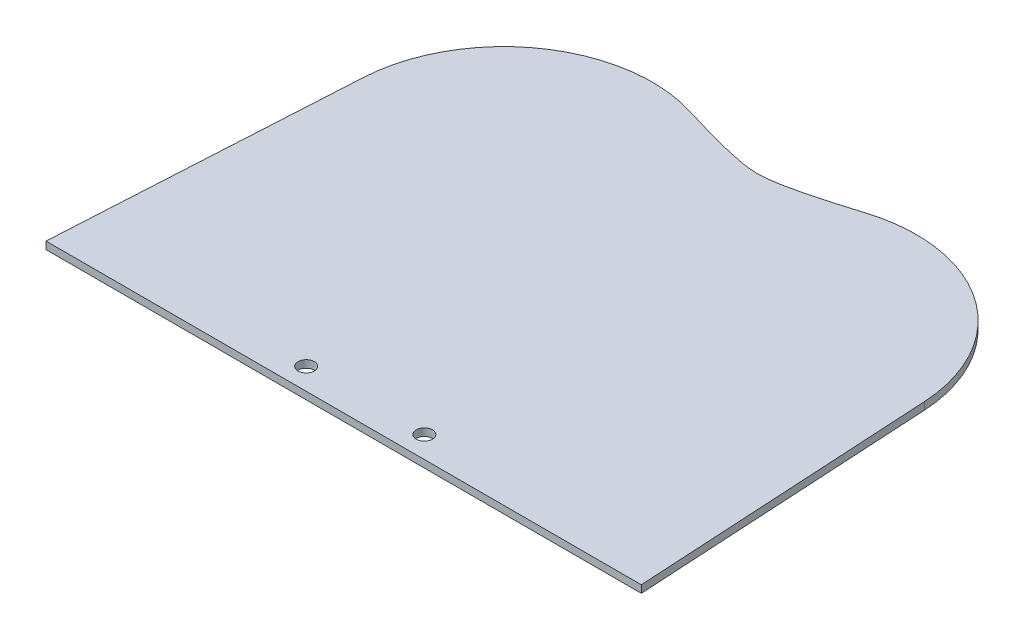
ISO-10303-21;
HEADER;
FILE_DESCRIPTION(('STEP AP214'),'2;1');
FILE_NAME('part.step','',(''),(''),'','','');
FILE_SCHEMA(('AUTOMOTIVE_DESIGN { 1 0 10303 214 1 1 1 1 }'));
ENDSEC;
DATA;
#1=APPLICATION_CONTEXT('core data for automotive mechanical design processes');
#2=APPLICATION_PROTOCOL_DEFINITION('international standard','automotive_design',2000,#1);
#3=PRODUCT_CONTEXT('',#1,'mechanical');
#4=PRODUCT('Part','Part','',(#3));
#5=PRODUCT_RELATED_PRODUCT_CATEGORY('part','',(#4));
#6=PRODUCT_DEFINITION_FORMATION('','',#4);
#7=PRODUCT_DEFINITION_CONTEXT('part definition',#1,'design');
#8=PRODUCT_DEFINITION('design','',#6,#7);
#9=PRODUCT_DEFINITION_SHAPE('','',#8);
#10=(LENGTH_UNIT() NAMED_UNIT(*) SI_UNIT(.MILLI.,.METRE.));
#11=(NAMED_UNIT(*) PLANE_ANGLE_UNIT() SI_UNIT($,.RADIAN.));
#12=(NAMED_UNIT(*) SI_UNIT($,.STERADIAN.) SOLID_ANGLE_UNIT());
#13=UNCERTAINTY_MEASURE_WITH_UNIT(LENGTH_MEASURE(1.E-05),#10,'distance_accuracy_value','');
#14=(GEOMETRIC_REPRESENTATION_CONTEXT(3) GLOBAL_UNCERTAINTY_ASSIGNED_CONTEXT((#13)) GLOBAL_UNIT_ASSIGNED_CONTEXT((#10,
#11,#12)) REPRESENTATION_CONTEXT('',''));
#15=CARTESIAN_POINT('',(0.,0.,0.));
#16=DIRECTION('',(0.,0.,1.));
#17=DIRECTION('',(1.,0.,0.));
#18=AXIS2_PLACEMENT_3D('',#15,#16,#17);
#19=CARTESIAN_POINT('',(0.,2.,0.));
#20=DIRECTION('',(0.,0.,-1.));
#21=DIRECTION('',(-1.,0.,0.));
#22=AXIS2_PLACEMENT_3D('',#19,#20,#21);
#23=PLANE('',#22);
#24=DIRECTION('',(1.,0.,0.));
#25=VECTOR('',#24,1.);
#26=CARTESIAN_POINT('',(0.,0.,0.));
#27=LINE('',#26,#25);
#28=CARTESIAN_POINT('',(0.,0.,0.));
#29=VERTEX_POINT('',#28);
#30=CARTESIAN_POINT('',(160.,0.,0.));
#31=VERTEX_POINT('',#30);
#32=EDGE_CURVE('E107',#29,#31,#27,.T.);
#33=ORIENTED_EDGE('',*,*,#32,.T.);
#34=DIRECTION('',(0.,-1.,0.));
#35=VECTOR('',#34,1.);
#36=CARTESIAN_POINT('',(160.,2.,0.));
#37=LINE('',#36,#35);
#38=CARTESIAN_POINT('',(160.,2.,0.));
#39=VERTEX_POINT('',#38);
#40=EDGE_CURVE('E48',#39,#31,#37,.T.);
#41=ORIENTED_EDGE('',*,*,#40,.F.);
#42=DIRECTION('',(1.,0.,0.));
#43=VECTOR('',#42,1.);
#44=CARTESIAN_POINT('',(0.,2.,0.));
#45=LINE('',#44,#43);
#46=CARTESIAN_POINT('',(0.,2.,0.));
#47=VERTEX_POINT('',#46);
#48=EDGE_CURVE('E113',#47,#39,#45,.T.);
#49=ORIENTED_EDGE('',*,*,#48,.F.);
#50=DIRECTION('',(0.,-1.,0.));
#51=VECTOR('',#50,1.);
#52=CARTESIAN_POINT('',(0.,2.,0.));
#53=LINE('',#52,#51);
#54=EDGE_CURVE('E11',#47,#29,#53,.T.);
#55=ORIENTED_EDGE('',*,*,#54,.T.);
#56=EDGE_LOOP('',(#33,#41,#49,#55));
#57=FACE_BOUND('',#56,.T.);
#58=ADVANCED_FACE('F41',(#57),#23,.F.);
#59=CARTESIAN_POINT('',(0.,2.,0.));
#60=DIRECTION('',(0.,-1.,0.));
#61=DIRECTION('',(0.,0.,-1.));
#62=AXIS2_PLACEMENT_3D('',#59,#60,#61);
#63=PLANE('',#62);
#64=CARTESIAN_POINT('',(64.12,2.,-5.81));
#65=DIRECTION('',(0.,1.,0.));
#66=DIRECTION('',(0.,0.,1.));
#67=AXIS2_PLACEMENT_3D('',#64,#65,#66);
#68=CIRCLE('',#67,2.185);
#69=CARTESIAN_POINT('',(64.12,2.,-3.625));
#70=VERTEX_POINT('',#69);
#71=EDGE_CURVE('E128',#70,#70,#68,.T.);
#72=ORIENTED_EDGE('',*,*,#71,.F.);
#73=EDGE_LOOP('',(#72));
#74=FACE_BOUND('',#73,.T.);
#75=CARTESIAN_POINT('',(95.87,2.,-5.81));
#76=DIRECTION('',(0.,1.,0.));
#77=DIRECTION('',(0.,0.,1.));
#78=AXIS2_PLACEMENT_3D('',#75,#76,#77);
#79=CIRCLE('',#78,2.185);
#80=CARTESIAN_POINT('',(95.87,2.,-3.625));
#81=VERTEX_POINT('',#80);
#82=EDGE_CURVE('E122',#81,#81,#79,.T.);
#83=ORIENTED_EDGE('',*,*,#82,.F.);
#84=EDGE_LOOP('',(#83));
#85=FACE_BOUND('',#84,.T.);
#86=CARTESIAN_POINT('',(44.5206222699094,2.,-78.48676821735));
#87=DIRECTION('',(0.,-1.,0.));
#88=DIRECTION('',(0.,0.,-1.));
#89=AXIS2_PLACEMENT_3D('',#86,#87,#88);
#90=CIRCLE('',#89,40.);
#91=CARTESIAN_POINT('',(4.58493819976732,2.,-80.7541759552303));
#92=VERTEX_POINT('',#91);
#93=CARTESIAN_POINT('',(56.3933458143429,2.,-116.684129849241));
#94=VERTEX_POINT('',#93);
#95=EDGE_CURVE('E281',#92,#94,#90,.T.);
#96=ORIENTED_EDGE('',*,*,#95,.F.);
#97=DIRECTION('',(0.0566851934470067,0.,-0.998392101753552));
#98=VECTOR('',#97,1.);
#99=CARTESIAN_POINT('',(0.,2.,0.));
#100=LINE('',#99,#98);
#101=EDGE_CURVE('E287',#47,#92,#100,.T.);
#102=ORIENTED_EDGE('',*,*,#101,.F.);
#103=ORIENTED_EDGE('',*,*,#48,.T.);
#104=DIRECTION('',(0.0566851934470067,0.,0.998392101753552));
#105=VECTOR('',#104,1.);
#106=CARTESIAN_POINT('',(160.,2.,0.));
#107=LINE('',#106,#105);
#108=CARTESIAN_POINT('',(155.415061800233,2.,-80.7541759552303));
#109=VERTEX_POINT('',#108);
#110=EDGE_CURVE('E60',#109,#39,#107,.T.);
#111=ORIENTED_EDGE('',*,*,#110,.F.);
#112=CARTESIAN_POINT('',(115.479377730091,2.,-78.48676821735));
#113=DIRECTION('',(0.,-1.,0.));
#114=DIRECTION('',(0.,0.,1.));
#115=AXIS2_PLACEMENT_3D('',#112,#113,#114);
#116=CIRCLE('',#115,40.);
#117=CARTESIAN_POINT('',(103.606654185657,2.,-116.684129849241));
#118=VERTEX_POINT('',#117);
#119=EDGE_CURVE('E260',#118,#109,#116,.T.);
#120=ORIENTED_EDGE('',*,*,#119,.F.);
#121=CARTESIAN_POINT('',(80.,2.,-111.276722040985));
#122=CARTESIAN_POINT('',(86.2097434625132,2.,-111.276722040985));
#123=CARTESIAN_POINT('',(103.606654185657,2.,-116.684129849241));
#124=B_SPLINE_CURVE_WITH_KNOTS('',2,(#121,#122,#123),.UNSPECIFIED.,.F.,.F.,(3,3),(0.,1.),.UNSPECIFIED.);
#125=CARTESIAN_POINT('',(80.,2.,-111.276722040985));
#126=VERTEX_POINT('',#125);
#127=EDGE_CURVE('E265',#126,#118,#124,.T.);
#128=ORIENTED_EDGE('',*,*,#127,.F.);
#129=CARTESIAN_POINT('',(56.3933458143429,2.,-116.684129849241));
#130=CARTESIAN_POINT('',(73.7902565374868,2.,-111.276722040985));
#131=CARTESIAN_POINT('',(80.,2.,-111.276722040985));
#132=B_SPLINE_CURVE_WITH_KNOTS('',2,(#129,#130,#131),.UNSPECIFIED.,.F.,.F.,(3,3),(0.,1.),.UNSPECIFIED.);
#133=EDGE_CURVE('E273',#94,#126,#132,.T.);
#134=ORIENTED_EDGE('',*,*,#133,.F.);
#135=EDGE_LOOP('',(#96,#102,#103,#111,#120,#128,#134));
#136=FACE_BOUND('',#135,.T.);
#137=ADVANCED_FACE('F164',(#74,#85,#136),#63,.F.);
#138=CARTESIAN_POINT('',(0.,0.,0.));
#139=DIRECTION('',(0.,-1.,0.));
#140=DIRECTION('',(0.,0.,-1.));
#141=AXIS2_PLACEMENT_3D('',#138,#139,#140);
#142=PLANE('',#141);
#143=DIRECTION('',(0.0566851934470067,0.,-0.998392101753552));
#144=VECTOR('',#143,1.);
#145=CARTESIAN_POINT('',(0.,0.,0.));
#146=LINE('',#145,#144);
#147=CARTESIAN_POINT('',(4.58493819976732,0.,-80.7541759552303));
#148=VERTEX_POINT('',#147);
#149=EDGE_CURVE('E97',#29,#148,#146,.T.);
#150=ORIENTED_EDGE('',*,*,#149,.T.);
#151=CARTESIAN_POINT('',(44.5206222699094,0.,-78.48676821735));
#152=DIRECTION('',(0.,-1.,0.));
#153=DIRECTION('',(0.,0.,-1.));
#154=AXIS2_PLACEMENT_3D('',#151,#152,#153);
#155=CIRCLE('',#154,40.);
#156=CARTESIAN_POINT('',(56.3933458143429,0.,-116.684129849241));
#157=VERTEX_POINT('',#156);
#158=EDGE_CURVE('E306',#148,#157,#155,.T.);
#159=ORIENTED_EDGE('',*,*,#158,.T.);
#160=CARTESIAN_POINT('',(56.3933458143429,0.,-116.684129849241));
#161=CARTESIAN_POINT('',(73.7902565374868,0.,-111.276722040985));
#162=CARTESIAN_POINT('',(80.,0.,-111.276722040985));
#163=B_SPLINE_CURVE_WITH_KNOTS('',2,(#160,#161,#162),.UNSPECIFIED.,.F.,.F.,(3,3),(0.,1.),.UNSPECIFIED.);
#164=CARTESIAN_POINT('',(80.,0.,-111.276722040985));
#165=VERTEX_POINT('',#164);
#166=EDGE_CURVE('E297',#157,#165,#163,.T.);
#167=ORIENTED_EDGE('',*,*,#166,.T.);
#168=CARTESIAN_POINT('',(80.,0.,-111.276722040985));
#169=CARTESIAN_POINT('',(86.2097434625132,0.,-111.276722040985));
#170=CARTESIAN_POINT('',(103.606654185657,0.,-116.684129849241));
#171=B_SPLINE_CURVE_WITH_KNOTS('',2,(#168,#169,#170),.UNSPECIFIED.,.F.,.F.,(3,3),(0.,1.),.UNSPECIFIED.);
#172=CARTESIAN_POINT('',(103.606654185657,0.,-116.684129849241));
#173=VERTEX_POINT('',#172);
#174=EDGE_CURVE('E291',#165,#173,#171,.T.);
#175=ORIENTED_EDGE('',*,*,#174,.T.);
#176=CARTESIAN_POINT('',(115.479377730091,0.,-78.48676821735));
#177=DIRECTION('',(0.,-1.,0.));
#178=DIRECTION('',(0.,0.,-1.));
#179=AXIS2_PLACEMENT_3D('',#176,#177,#178);
#180=CIRCLE('',#179,40.);
#181=CARTESIAN_POINT('',(155.415061800233,0.,-80.7541759552303));
#182=VERTEX_POINT('',#181);
#183=EDGE_CURVE('E257',#173,#182,#180,.T.);
#184=ORIENTED_EDGE('',*,*,#183,.T.);
#185=DIRECTION('',(0.0566851934470067,0.,0.998392101753552));
#186=VECTOR('',#185,1.);
#187=CARTESIAN_POINT('',(160.,0.,0.));
#188=LINE('',#187,#186);
#189=EDGE_CURVE('E111',#182,#31,#188,.T.);
#190=ORIENTED_EDGE('',*,*,#189,.T.);
#191=ORIENTED_EDGE('',*,*,#32,.F.);
#192=EDGE_LOOP('',(#150,#159,#167,#175,#184,#190,#191));
#193=FACE_BOUND('',#192,.T.);
#194=CARTESIAN_POINT('',(64.12,0.,-5.81));
#195=DIRECTION('',(0.,-1.,0.));
#196=DIRECTION('',(0.,0.,-1.));
#197=AXIS2_PLACEMENT_3D('',#194,#195,#196);
#198=CIRCLE('',#197,2.185);
#199=CARTESIAN_POINT('',(64.12,0.,-7.99499999999999));
#200=VERTEX_POINT('',#199);
#201=EDGE_CURVE('E125',#200,#200,#198,.F.);
#202=ORIENTED_EDGE('',*,*,#201,.T.);
#203=EDGE_LOOP('',(#202));
#204=FACE_BOUND('',#203,.T.);
#205=CARTESIAN_POINT('',(95.87,0.,-5.81));
#206=DIRECTION('',(0.,-1.,0.));
#207=DIRECTION('',(0.,0.,-1.));
#208=AXIS2_PLACEMENT_3D('',#205,#206,#207);
#209=CIRCLE('',#208,2.185);
#210=CARTESIAN_POINT('',(95.87,0.,-7.99499999999999));
#211=VERTEX_POINT('',#210);
#212=EDGE_CURVE('E114',#211,#211,#209,.F.);
#213=ORIENTED_EDGE('',*,*,#212,.T.);
#214=EDGE_LOOP('',(#213));
#215=FACE_BOUND('',#214,.T.);
#216=ADVANCED_FACE('F108',(#193,#204,#215),#142,.T.);
#217=CARTESIAN_POINT('',(95.87,-6.18011326757041,-5.81));
#218=DIRECTION('',(0.,1.,0.));
#219=DIRECTION('',(0.,0.,1.));
#220=AXIS2_PLACEMENT_3D('',#217,#218,#219);
#221=CYLINDRICAL_SURFACE('',#220,2.185);
#222=ORIENTED_EDGE('',*,*,#82,.T.);
#223=EDGE_LOOP('',(#222));
#224=FACE_BOUND('',#223,.T.);
#225=ORIENTED_EDGE('',*,*,#212,.F.);
#226=EDGE_LOOP('',(#225));
#227=FACE_BOUND('',#226,.T.);
#228=ADVANCED_FACE('F159',(#224,#227),#221,.F.);
#229=CARTESIAN_POINT('',(64.12,-6.18011326757041,-5.81));
#230=DIRECTION('',(0.,1.,0.));
#231=DIRECTION('',(0.,0.,1.));
#232=AXIS2_PLACEMENT_3D('',#229,#230,#231);
#233=CYLINDRICAL_SURFACE('',#232,2.185);
#234=ORIENTED_EDGE('',*,*,#71,.T.);
#235=EDGE_LOOP('',(#234));
#236=FACE_BOUND('',#235,.T.);
#237=ORIENTED_EDGE('',*,*,#201,.F.);
#238=EDGE_LOOP('',(#237));
#239=FACE_BOUND('',#238,.T.);
#240=ADVANCED_FACE('F156',(#236,#239),#233,.F.);
#241=CARTESIAN_POINT('',(0.,-209.220997100423,0.));
#242=DIRECTION('',(0.998392101753552,0.,0.0566851934470067));
#243=DIRECTION('',(0.0566851934470067,0.,-0.998392101753552));
#244=AXIS2_PLACEMENT_3D('',#241,#242,#243);
#245=PLANE('',#244);
#246=ORIENTED_EDGE('',*,*,#54,.F.);
#247=ORIENTED_EDGE('',*,*,#101,.T.);
#248=DIRECTION('',(0.,1.,0.));
#249=VECTOR('',#248,1.);
#250=CARTESIAN_POINT('',(4.58493819976732,-209.220997100423,-80.7541759552303));
#251=LINE('',#250,#249);
#252=EDGE_CURVE('E102',#148,#92,#251,.T.);
#253=ORIENTED_EDGE('',*,*,#252,.F.);
#254=ORIENTED_EDGE('',*,*,#149,.F.);
#255=EDGE_LOOP('',(#246,#247,#253,#254));
#256=FACE_BOUND('',#255,.T.);
#257=ADVANCED_FACE('F99',(#256),#245,.F.);
#258=CARTESIAN_POINT('',(44.5206222699094,-209.220997100423,-78.48676821735));
#259=DIRECTION('',(0.,1.,0.));
#260=DIRECTION('',(0.,0.,1.));
#261=AXIS2_PLACEMENT_3D('',#258,#259,#260);
#262=CYLINDRICAL_SURFACE('',#261,40.);
#263=ORIENTED_EDGE('',*,*,#252,.T.);
#264=ORIENTED_EDGE('',*,*,#95,.T.);
#265=DIRECTION('',(0.,1.,0.));
#266=VECTOR('',#265,1.);
#267=CARTESIAN_POINT('',(56.3933458143429,-209.220997100423,-116.684129849241));
#268=LINE('',#267,#266);
#269=EDGE_CURVE('E305',#157,#94,#268,.T.);
#270=ORIENTED_EDGE('',*,*,#269,.F.);
#271=ORIENTED_EDGE('',*,*,#158,.F.);
#272=EDGE_LOOP('',(#263,#264,#270,#271));
#273=FACE_BOUND('',#272,.T.);
#274=ADVANCED_FACE('F148',(#273),#262,.T.);
#275=CARTESIAN_POINT('',(56.3933458143429,-209.220997100423,-116.684129849241));
#276=CARTESIAN_POINT('',(73.7902565374868,-209.220997100423,-111.276722040985));
#277=CARTESIAN_POINT('',(80.,-209.220997100423,-111.276722040985));
#278=B_SPLINE_CURVE_WITH_KNOTS('',2,(#275,#276,#277),.UNSPECIFIED.,.F.,.F.,(3,3),(0.,1.),.UNSPECIFIED.);
#279=DIRECTION('',(0.,1.,0.));
#280=VECTOR('',#279,1.);
#281=SURFACE_OF_LINEAR_EXTRUSION('',#278,#280);
#282=ORIENTED_EDGE('',*,*,#269,.T.);
#283=ORIENTED_EDGE('',*,*,#133,.T.);
#284=DIRECTION('',(0.,1.,0.));
#285=VECTOR('',#284,1.);
#286=CARTESIAN_POINT('',(80.,-209.220997100423,-111.276722040985));
#287=LINE('',#286,#285);
#288=EDGE_CURVE('E296',#165,#126,#287,.T.);
#289=ORIENTED_EDGE('',*,*,#288,.F.);
#290=ORIENTED_EDGE('',*,*,#166,.F.);
#291=EDGE_LOOP('',(#282,#283,#289,#290));
#292=FACE_BOUND('',#291,.T.);
#293=ADVANCED_FACE('F143',(#292),#281,.F.);
#294=CARTESIAN_POINT('',(80.,-209.220997100423,-111.276722040985));
#295=CARTESIAN_POINT('',(86.2097434625132,-209.220997100423,-111.276722040985));
#296=CARTESIAN_POINT('',(103.606654185657,-209.220997100423,-116.684129849241));
#297=B_SPLINE_CURVE_WITH_KNOTS('',2,(#294,#295,#296),.UNSPECIFIED.,.F.,.F.,(3,3),(0.,1.),.UNSPECIFIED.);
#298=DIRECTION('',(0.,1.,0.));
#299=VECTOR('',#298,1.);
#300=SURFACE_OF_LINEAR_EXTRUSION('',#297,#299);
#301=ORIENTED_EDGE('',*,*,#288,.T.);
#302=ORIENTED_EDGE('',*,*,#127,.T.);
#303=DIRECTION('',(0.,1.,0.));
#304=VECTOR('',#303,1.);
#305=CARTESIAN_POINT('',(103.606654185657,-209.220997100423,-116.684129849241));
#306=LINE('',#305,#304);
#307=EDGE_CURVE('E262',#173,#118,#306,.T.);
#308=ORIENTED_EDGE('',*,*,#307,.F.);
#309=ORIENTED_EDGE('',*,*,#174,.F.);
#310=EDGE_LOOP('',(#301,#302,#308,#309));
#311=FACE_BOUND('',#310,.T.);
#312=ADVANCED_FACE('F147',(#311),#300,.F.);
#313=CARTESIAN_POINT('',(115.479377730091,-209.220997100423,-78.48676821735));
#314=DIRECTION('',(0.,1.,0.));
#315=DIRECTION('',(0.,0.,1.));
#316=AXIS2_PLACEMENT_3D('',#313,#314,#315);
#317=CYLINDRICAL_SURFACE('',#316,40.);
#318=ORIENTED_EDGE('',*,*,#307,.T.);
#319=ORIENTED_EDGE('',*,*,#119,.T.);
#320=DIRECTION('',(0.,1.,0.));
#321=VECTOR('',#320,1.);
#322=CARTESIAN_POINT('',(155.415061800233,-209.220997100423,-80.7541759552303));
#323=LINE('',#322,#321);
#324=EDGE_CURVE('E255',#182,#109,#323,.T.);
#325=ORIENTED_EDGE('',*,*,#324,.F.);
#326=ORIENTED_EDGE('',*,*,#183,.F.);
#327=EDGE_LOOP('',(#318,#319,#325,#326));
#328=FACE_BOUND('',#327,.T.);
#329=ADVANCED_FACE('F211',(#328),#317,.T.);
#330=CARTESIAN_POINT('',(160.,-209.220997100423,0.));
#331=DIRECTION('',(-0.998392101753552,0.,0.0566851934470067));
#332=DIRECTION('',(0.0566851934470067,0.,0.998392101753552));
#333=AXIS2_PLACEMENT_3D('',#330,#331,#332);
#334=PLANE('',#333);
#335=ORIENTED_EDGE('',*,*,#324,.T.);
#336=ORIENTED_EDGE('',*,*,#110,.T.);
#337=ORIENTED_EDGE('',*,*,#40,.T.);
#338=ORIENTED_EDGE('',*,*,#189,.F.);
#339=EDGE_LOOP('',(#335,#336,#337,#338));
#340=FACE_BOUND('',#339,.T.);
#341=ADVANCED_FACE('F219',(#340),#334,.F.);
#342=CLOSED_SHELL('',(#58,#137,#216,#228,#240,#257,#274,#293,#312,#329,#341));
#343=MANIFOLD_SOLID_BREP('B2',#342);
#344=ADVANCED_BREP_SHAPE_REPRESENTATION('',(#18,#343),#14);
#345=SHAPE_DEFINITION_REPRESENTATION(#9,#344);
ENDSEC;
END-ISO-10303-21;
